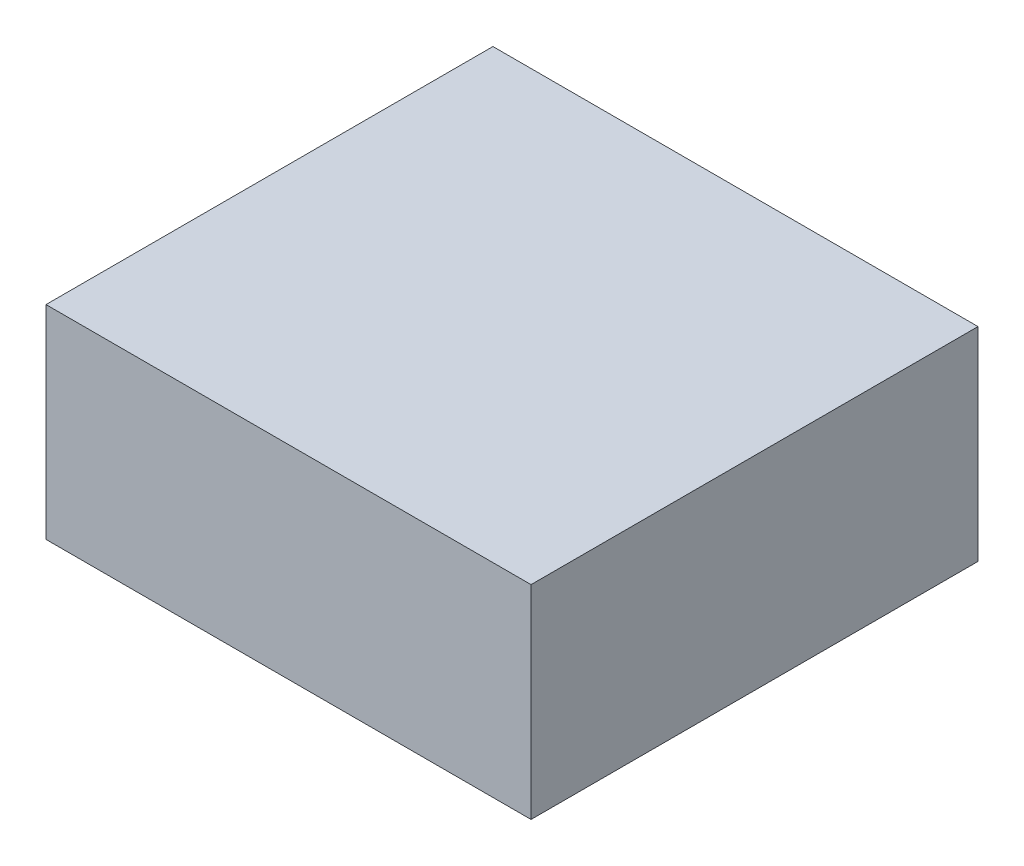
ISO-10303-21;
HEADER;
FILE_DESCRIPTION(('STEP AP214'),'2;1');
FILE_NAME('part.step','',(''),(''),'','','');
FILE_SCHEMA(('AUTOMOTIVE_DESIGN { 1 0 10303 214 1 1 1 1 }'));
ENDSEC;
DATA;
#1=APPLICATION_CONTEXT('core data for automotive mechanical design processes');
#2=APPLICATION_PROTOCOL_DEFINITION('international standard','automotive_design',2000,#1);
#3=PRODUCT_CONTEXT('',#1,'mechanical');
#4=PRODUCT('Part','Part','',(#3));
#5=PRODUCT_RELATED_PRODUCT_CATEGORY('part','',(#4));
#6=PRODUCT_DEFINITION_FORMATION('','',#4);
#7=PRODUCT_DEFINITION_CONTEXT('part definition',#1,'design');
#8=PRODUCT_DEFINITION('design','',#6,#7);
#9=PRODUCT_DEFINITION_SHAPE('','',#8);
#10=(LENGTH_UNIT() NAMED_UNIT(*) SI_UNIT(.MILLI.,.METRE.));
#11=(NAMED_UNIT(*) PLANE_ANGLE_UNIT() SI_UNIT($,.RADIAN.));
#12=(NAMED_UNIT(*) SI_UNIT($,.STERADIAN.) SOLID_ANGLE_UNIT());
#13=UNCERTAINTY_MEASURE_WITH_UNIT(LENGTH_MEASURE(1.E-05),#10,'distance_accuracy_value','');
#14=(GEOMETRIC_REPRESENTATION_CONTEXT(3) GLOBAL_UNCERTAINTY_ASSIGNED_CONTEXT((#13)) GLOBAL_UNIT_ASSIGNED_CONTEXT((#10,
#11,#12)) REPRESENTATION_CONTEXT('',''));
#15=CARTESIAN_POINT('',(0.,0.,0.));
#16=DIRECTION('',(0.,0.,1.));
#17=DIRECTION('',(1.,0.,0.));
#18=AXIS2_PLACEMENT_3D('',#15,#16,#17);
#19=CARTESIAN_POINT('',(90.551,75.946,-83.439));
#20=DIRECTION('',(-1.,0.,0.));
#21=DIRECTION('',(0.,0.,1.));
#22=AXIS2_PLACEMENT_3D('',#19,#20,#21);
#23=PLANE('',#22);
#24=DIRECTION('',(0.,0.,-1.));
#25=VECTOR('',#24,1.);
#26=CARTESIAN_POINT('',(90.551,0.,-83.439));
#27=LINE('',#26,#25);
#28=CARTESIAN_POINT('',(90.551,0.,83.439));
#29=VERTEX_POINT('',#28);
#30=CARTESIAN_POINT('',(90.551,0.,-83.439));
#31=VERTEX_POINT('',#30);
#32=EDGE_CURVE('E102',#29,#31,#27,.T.);
#33=ORIENTED_EDGE('',*,*,#32,.T.);
#34=DIRECTION('',(0.,-1.,0.));
#35=VECTOR('',#34,1.);
#36=CARTESIAN_POINT('',(90.551,75.946,-83.439));
#37=LINE('',#36,#35);
#38=CARTESIAN_POINT('',(90.551,75.946,-83.439));
#39=VERTEX_POINT('',#38);
#40=EDGE_CURVE('E11',#39,#31,#37,.T.);
#41=ORIENTED_EDGE('',*,*,#40,.F.);
#42=DIRECTION('',(0.,0.,-1.));
#43=VECTOR('',#42,1.);
#44=CARTESIAN_POINT('',(90.551,75.946,-83.439));
#45=LINE('',#44,#43);
#46=CARTESIAN_POINT('',(90.551,75.946,83.439));
#47=VERTEX_POINT('',#46);
#48=EDGE_CURVE('E90',#47,#39,#45,.T.);
#49=ORIENTED_EDGE('',*,*,#48,.F.);
#50=DIRECTION('',(0.,-1.,0.));
#51=VECTOR('',#50,1.);
#52=CARTESIAN_POINT('',(90.551,75.946,83.439));
#53=LINE('',#52,#51);
#54=EDGE_CURVE('E98',#47,#29,#53,.T.);
#55=ORIENTED_EDGE('',*,*,#54,.T.);
#56=EDGE_LOOP('',(#33,#41,#49,#55));
#57=FACE_BOUND('',#56,.T.);
#58=ADVANCED_FACE('F39',(#57),#23,.F.);
#59=CARTESIAN_POINT('',(-90.551,75.946,-83.439));
#60=DIRECTION('',(0.,0.,1.));
#61=DIRECTION('',(1.,0.,0.));
#62=AXIS2_PLACEMENT_3D('',#59,#60,#61);
#63=PLANE('',#62);
#64=DIRECTION('',(-1.,0.,0.));
#65=VECTOR('',#64,1.);
#66=CARTESIAN_POINT('',(-90.551,0.,-83.439));
#67=LINE('',#66,#65);
#68=CARTESIAN_POINT('',(-90.551,0.,-83.439));
#69=VERTEX_POINT('',#68);
#70=EDGE_CURVE('E94',#31,#69,#67,.T.);
#71=ORIENTED_EDGE('',*,*,#70,.T.);
#72=DIRECTION('',(0.,-1.,0.));
#73=VECTOR('',#72,1.);
#74=CARTESIAN_POINT('',(-90.551,75.946,-83.439));
#75=LINE('',#74,#73);
#76=CARTESIAN_POINT('',(-90.551,75.946,-83.439));
#77=VERTEX_POINT('',#76);
#78=EDGE_CURVE('E47',#77,#69,#75,.T.);
#79=ORIENTED_EDGE('',*,*,#78,.F.);
#80=DIRECTION('',(-1.,0.,0.));
#81=VECTOR('',#80,1.);
#82=CARTESIAN_POINT('',(-90.551,75.946,-83.439));
#83=LINE('',#82,#81);
#84=EDGE_CURVE('E85',#39,#77,#83,.T.);
#85=ORIENTED_EDGE('',*,*,#84,.F.);
#86=ORIENTED_EDGE('',*,*,#40,.T.);
#87=EDGE_LOOP('',(#71,#79,#85,#86));
#88=FACE_BOUND('',#87,.T.);
#89=ADVANCED_FACE('F93',(#88),#63,.F.);
#90=CARTESIAN_POINT('',(-90.551,75.946,-83.439));
#91=DIRECTION('',(1.,0.,0.));
#92=DIRECTION('',(0.,0.,-1.));
#93=AXIS2_PLACEMENT_3D('',#90,#91,#92);
#94=PLANE('',#93);
#95=DIRECTION('',(0.,0.,1.));
#96=VECTOR('',#95,1.);
#97=CARTESIAN_POINT('',(-90.551,0.,-83.439));
#98=LINE('',#97,#96);
#99=CARTESIAN_POINT('',(-90.551,0.,83.439));
#100=VERTEX_POINT('',#99);
#101=EDGE_CURVE('E72',#69,#100,#98,.T.);
#102=ORIENTED_EDGE('',*,*,#101,.T.);
#103=DIRECTION('',(0.,-1.,0.));
#104=VECTOR('',#103,1.);
#105=CARTESIAN_POINT('',(-90.551,75.946,83.439));
#106=LINE('',#105,#104);
#107=CARTESIAN_POINT('',(-90.551,75.946,83.439));
#108=VERTEX_POINT('',#107);
#109=EDGE_CURVE('E95',#108,#100,#106,.T.);
#110=ORIENTED_EDGE('',*,*,#109,.F.);
#111=DIRECTION('',(0.,0.,1.));
#112=VECTOR('',#111,1.);
#113=CARTESIAN_POINT('',(-90.551,75.946,-83.439));
#114=LINE('',#113,#112);
#115=EDGE_CURVE('E88',#77,#108,#114,.T.);
#116=ORIENTED_EDGE('',*,*,#115,.F.);
#117=ORIENTED_EDGE('',*,*,#78,.T.);
#118=EDGE_LOOP('',(#102,#110,#116,#117));
#119=FACE_BOUND('',#118,.T.);
#120=ADVANCED_FACE('F96',(#119),#94,.F.);
#121=CARTESIAN_POINT('',(-90.551,75.946,83.439));
#122=DIRECTION('',(0.,0.,-1.));
#123=DIRECTION('',(-1.,0.,0.));
#124=AXIS2_PLACEMENT_3D('',#121,#122,#123);
#125=PLANE('',#124);
#126=DIRECTION('',(1.,0.,0.));
#127=VECTOR('',#126,1.);
#128=CARTESIAN_POINT('',(-90.551,0.,83.439));
#129=LINE('',#128,#127);
#130=EDGE_CURVE('E78',#100,#29,#129,.T.);
#131=ORIENTED_EDGE('',*,*,#130,.T.);
#132=ORIENTED_EDGE('',*,*,#54,.F.);
#133=DIRECTION('',(1.,0.,0.));
#134=VECTOR('',#133,1.);
#135=CARTESIAN_POINT('',(-90.551,75.946,83.439));
#136=LINE('',#135,#134);
#137=EDGE_CURVE('E55',#108,#47,#136,.T.);
#138=ORIENTED_EDGE('',*,*,#137,.F.);
#139=ORIENTED_EDGE('',*,*,#109,.T.);
#140=EDGE_LOOP('',(#131,#132,#138,#139));
#141=FACE_BOUND('',#140,.T.);
#142=ADVANCED_FACE('F109',(#141),#125,.F.);
#143=CARTESIAN_POINT('',(0.,75.946,0.));
#144=DIRECTION('',(0.,1.,0.));
#145=DIRECTION('',(0.,0.,1.));
#146=AXIS2_PLACEMENT_3D('',#143,#144,#145);
#147=PLANE('',#146);
#148=ORIENTED_EDGE('',*,*,#48,.T.);
#149=ORIENTED_EDGE('',*,*,#84,.T.);
#150=ORIENTED_EDGE('',*,*,#115,.T.);
#151=ORIENTED_EDGE('',*,*,#137,.T.);
#152=EDGE_LOOP('',(#148,#149,#150,#151));
#153=FACE_BOUND('',#152,.T.);
#154=ADVANCED_FACE('F86',(#153),#147,.T.);
#155=CARTESIAN_POINT('',(0.,0.,0.));
#156=DIRECTION('',(0.,1.,0.));
#157=DIRECTION('',(0.,0.,1.));
#158=AXIS2_PLACEMENT_3D('',#155,#156,#157);
#159=PLANE('',#158);
#160=ORIENTED_EDGE('',*,*,#32,.F.);
#161=ORIENTED_EDGE('',*,*,#130,.F.);
#162=ORIENTED_EDGE('',*,*,#101,.F.);
#163=ORIENTED_EDGE('',*,*,#70,.F.);
#164=EDGE_LOOP('',(#160,#161,#162,#163));
#165=FACE_BOUND('',#164,.T.);
#166=ADVANCED_FACE('F112',(#165),#159,.F.);
#167=CLOSED_SHELL('',(#58,#89,#120,#142,#154,#166));
#168=MANIFOLD_SOLID_BREP('B2',#167);
#169=ADVANCED_BREP_SHAPE_REPRESENTATION('',(#18,#168),#14);
#170=SHAPE_DEFINITION_REPRESENTATION(#9,#169);
ENDSEC;
END-ISO-10303-21;
